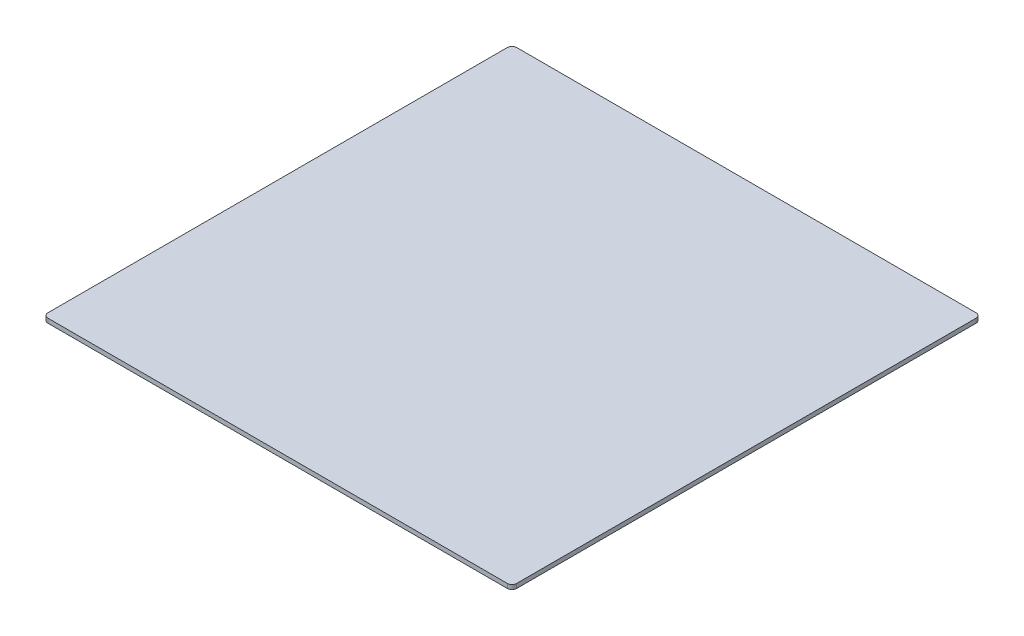
ISO-10303-21;
HEADER;
FILE_DESCRIPTION(('STEP AP214'),'2;1');
FILE_NAME('part.step','',(''),(''),'','','');
FILE_SCHEMA(('AUTOMOTIVE_DESIGN { 1 0 10303 214 1 1 1 1 }'));
ENDSEC;
DATA;
#1=APPLICATION_CONTEXT('core data for automotive mechanical design processes');
#2=APPLICATION_PROTOCOL_DEFINITION('international standard','automotive_design',2000,#1);
#3=PRODUCT_CONTEXT('',#1,'mechanical');
#4=PRODUCT('Part','Part','',(#3));
#5=PRODUCT_RELATED_PRODUCT_CATEGORY('part','',(#4));
#6=PRODUCT_DEFINITION_FORMATION('','',#4);
#7=PRODUCT_DEFINITION_CONTEXT('part definition',#1,'design');
#8=PRODUCT_DEFINITION('design','',#6,#7);
#9=PRODUCT_DEFINITION_SHAPE('','',#8);
#10=(LENGTH_UNIT() NAMED_UNIT(*) SI_UNIT(.MILLI.,.METRE.));
#11=(NAMED_UNIT(*) PLANE_ANGLE_UNIT() SI_UNIT($,.RADIAN.));
#12=(NAMED_UNIT(*) SI_UNIT($,.STERADIAN.) SOLID_ANGLE_UNIT());
#13=UNCERTAINTY_MEASURE_WITH_UNIT(LENGTH_MEASURE(1.E-05),#10,'distance_accuracy_value','');
#14=(GEOMETRIC_REPRESENTATION_CONTEXT(3) GLOBAL_UNCERTAINTY_ASSIGNED_CONTEXT((#13)) GLOBAL_UNIT_ASSIGNED_CONTEXT((#10,
#11,#12)) REPRESENTATION_CONTEXT('',''));
#15=CARTESIAN_POINT('',(0.,0.,0.));
#16=DIRECTION('',(0.,0.,1.));
#17=DIRECTION('',(1.,0.,0.));
#18=AXIS2_PLACEMENT_3D('',#15,#16,#17);
#19=CARTESIAN_POINT('',(50.,0.46865,-50.));
#20=DIRECTION('',(-1.,0.,0.));
#21=DIRECTION('',(0.,0.,1.));
#22=AXIS2_PLACEMENT_3D('',#19,#20,#21);
#23=PLANE('',#22);
#24=DIRECTION('',(0.,0.,-1.));
#25=VECTOR('',#24,1.);
#26=CARTESIAN_POINT('',(50.,0.46865,-50.));
#27=LINE('',#26,#25);
#28=CARTESIAN_POINT('',(50.,0.46865,49.));
#29=VERTEX_POINT('',#28);
#30=CARTESIAN_POINT('',(50.,0.46865,-49.));
#31=VERTEX_POINT('',#30);
#32=EDGE_CURVE('E126',#29,#31,#27,.T.);
#33=ORIENTED_EDGE('',*,*,#32,.F.);
#34=DIRECTION('',(0.,-1.,0.));
#35=VECTOR('',#34,1.);
#36=CARTESIAN_POINT('',(50.,0.46865,49.));
#37=LINE('',#36,#35);
#38=CARTESIAN_POINT('',(50.,-0.46865,49.));
#39=VERTEX_POINT('',#38);
#40=EDGE_CURVE('E110',#29,#39,#37,.T.);
#41=ORIENTED_EDGE('',*,*,#40,.T.);
#42=DIRECTION('',(0.,0.,-1.));
#43=VECTOR('',#42,1.);
#44=CARTESIAN_POINT('',(50.,-0.46865,-50.));
#45=LINE('',#44,#43);
#46=CARTESIAN_POINT('',(50.,-0.46865,-49.));
#47=VERTEX_POINT('',#46);
#48=EDGE_CURVE('E123',#39,#47,#45,.T.);
#49=ORIENTED_EDGE('',*,*,#48,.T.);
#50=DIRECTION('',(0.,-1.,0.));
#51=VECTOR('',#50,1.);
#52=CARTESIAN_POINT('',(50.,0.46865,-49.));
#53=LINE('',#52,#51);
#54=EDGE_CURVE('E129',#47,#31,#53,.F.);
#55=ORIENTED_EDGE('',*,*,#54,.T.);
#56=EDGE_LOOP('',(#33,#41,#49,#55));
#57=FACE_BOUND('',#56,.T.);
#58=ADVANCED_FACE('F39',(#57),#23,.F.);
#59=CARTESIAN_POINT('',(-50.,0.46865,-50.));
#60=DIRECTION('',(0.,0.,1.));
#61=DIRECTION('',(1.,0.,0.));
#62=AXIS2_PLACEMENT_3D('',#59,#60,#61);
#63=PLANE('',#62);
#64=DIRECTION('',(-1.,0.,0.));
#65=VECTOR('',#64,1.);
#66=CARTESIAN_POINT('',(-50.,-0.46865,-50.));
#67=LINE('',#66,#65);
#68=CARTESIAN_POINT('',(49.,-0.46865,-50.));
#69=VERTEX_POINT('',#68);
#70=CARTESIAN_POINT('',(-49.,-0.46865,-50.));
#71=VERTEX_POINT('',#70);
#72=EDGE_CURVE('E134',#69,#71,#67,.T.);
#73=ORIENTED_EDGE('',*,*,#72,.T.);
#74=DIRECTION('',(0.,-1.,0.));
#75=VECTOR('',#74,1.);
#76=CARTESIAN_POINT('',(-49.,0.46865,-50.));
#77=LINE('',#76,#75);
#78=CARTESIAN_POINT('',(-49.,0.46865,-50.));
#79=VERTEX_POINT('',#78);
#80=EDGE_CURVE('E11',#71,#79,#77,.F.);
#81=ORIENTED_EDGE('',*,*,#80,.T.);
#82=DIRECTION('',(-1.,0.,0.));
#83=VECTOR('',#82,1.);
#84=CARTESIAN_POINT('',(-50.,0.46865,-50.));
#85=LINE('',#84,#83);
#86=CARTESIAN_POINT('',(49.,0.46865,-50.));
#87=VERTEX_POINT('',#86);
#88=EDGE_CURVE('E186',#87,#79,#85,.T.);
#89=ORIENTED_EDGE('',*,*,#88,.F.);
#90=DIRECTION('',(0.,-1.,0.));
#91=VECTOR('',#90,1.);
#92=CARTESIAN_POINT('',(49.,0.46865,-50.));
#93=LINE('',#92,#91);
#94=EDGE_CURVE('E48',#87,#69,#93,.T.);
#95=ORIENTED_EDGE('',*,*,#94,.T.);
#96=EDGE_LOOP('',(#73,#81,#89,#95));
#97=FACE_BOUND('',#96,.T.);
#98=ADVANCED_FACE('F184',(#97),#63,.F.);
#99=CARTESIAN_POINT('',(-50.,0.46865,-50.));
#100=DIRECTION('',(1.,0.,0.));
#101=DIRECTION('',(0.,0.,-1.));
#102=AXIS2_PLACEMENT_3D('',#99,#100,#101);
#103=PLANE('',#102);
#104=DIRECTION('',(0.,0.,1.));
#105=VECTOR('',#104,1.);
#106=CARTESIAN_POINT('',(-50.,-0.46865,-50.));
#107=LINE('',#106,#105);
#108=CARTESIAN_POINT('',(-50.,-0.46865,-49.));
#109=VERTEX_POINT('',#108);
#110=CARTESIAN_POINT('',(-50.,-0.46865,49.));
#111=VERTEX_POINT('',#110);
#112=EDGE_CURVE('E138',#109,#111,#107,.T.);
#113=ORIENTED_EDGE('',*,*,#112,.T.);
#114=DIRECTION('',(0.,-1.,0.));
#115=VECTOR('',#114,1.);
#116=CARTESIAN_POINT('',(-50.,0.46865,49.));
#117=LINE('',#116,#115);
#118=CARTESIAN_POINT('',(-50.,0.46865,49.));
#119=VERTEX_POINT('',#118);
#120=EDGE_CURVE('E55',#111,#119,#117,.F.);
#121=ORIENTED_EDGE('',*,*,#120,.T.);
#122=DIRECTION('',(0.,0.,1.));
#123=VECTOR('',#122,1.);
#124=CARTESIAN_POINT('',(-50.,0.46865,-50.));
#125=LINE('',#124,#123);
#126=CARTESIAN_POINT('',(-50.,0.46865,-49.));
#127=VERTEX_POINT('',#126);
#128=EDGE_CURVE('E194',#127,#119,#125,.T.);
#129=ORIENTED_EDGE('',*,*,#128,.F.);
#130=DIRECTION('',(0.,-1.,0.));
#131=VECTOR('',#130,1.);
#132=CARTESIAN_POINT('',(-50.,0.46865,-49.));
#133=LINE('',#132,#131);
#134=EDGE_CURVE('E174',#127,#109,#133,.T.);
#135=ORIENTED_EDGE('',*,*,#134,.T.);
#136=EDGE_LOOP('',(#113,#121,#129,#135));
#137=FACE_BOUND('',#136,.T.);
#138=ADVANCED_FACE('F193',(#137),#103,.F.);
#139=CARTESIAN_POINT('',(-50.,0.46865,50.));
#140=DIRECTION('',(0.,0.,-1.));
#141=DIRECTION('',(-1.,0.,0.));
#142=AXIS2_PLACEMENT_3D('',#139,#140,#141);
#143=PLANE('',#142);
#144=DIRECTION('',(1.,0.,0.));
#145=VECTOR('',#144,1.);
#146=CARTESIAN_POINT('',(-50.,-0.46865,50.));
#147=LINE('',#146,#145);
#148=CARTESIAN_POINT('',(-49.,-0.46865,50.));
#149=VERTEX_POINT('',#148);
#150=CARTESIAN_POINT('',(49.,-0.46865,50.));
#151=VERTEX_POINT('',#150);
#152=EDGE_CURVE('E146',#149,#151,#147,.T.);
#153=ORIENTED_EDGE('',*,*,#152,.T.);
#154=DIRECTION('',(0.,-1.,0.));
#155=VECTOR('',#154,1.);
#156=CARTESIAN_POINT('',(49.,0.46865,50.));
#157=LINE('',#156,#155);
#158=CARTESIAN_POINT('',(49.,0.46865,50.));
#159=VERTEX_POINT('',#158);
#160=EDGE_CURVE('E111',#151,#159,#157,.F.);
#161=ORIENTED_EDGE('',*,*,#160,.T.);
#162=DIRECTION('',(1.,0.,0.));
#163=VECTOR('',#162,1.);
#164=CARTESIAN_POINT('',(-50.,0.46865,50.));
#165=LINE('',#164,#163);
#166=CARTESIAN_POINT('',(-49.,0.46865,50.));
#167=VERTEX_POINT('',#166);
#168=EDGE_CURVE('E141',#167,#159,#165,.T.);
#169=ORIENTED_EDGE('',*,*,#168,.F.);
#170=DIRECTION('',(0.,-1.,0.));
#171=VECTOR('',#170,1.);
#172=CARTESIAN_POINT('',(-49.,0.46865,50.));
#173=LINE('',#172,#171);
#174=EDGE_CURVE('E117',#167,#149,#173,.T.);
#175=ORIENTED_EDGE('',*,*,#174,.T.);
#176=EDGE_LOOP('',(#153,#161,#169,#175));
#177=FACE_BOUND('',#176,.T.);
#178=ADVANCED_FACE('F226',(#177),#143,.F.);
#179=CARTESIAN_POINT('',(0.,0.46865,0.));
#180=DIRECTION('',(0.,1.,0.));
#181=DIRECTION('',(0.,0.,1.));
#182=AXIS2_PLACEMENT_3D('',#179,#180,#181);
#183=PLANE('',#182);
#184=ORIENTED_EDGE('',*,*,#168,.T.);
#185=CARTESIAN_POINT('',(49.,0.46865,49.));
#186=DIRECTION('',(0.,1.,0.));
#187=DIRECTION('',(0.,0.,1.));
#188=AXIS2_PLACEMENT_3D('',#185,#186,#187);
#189=CIRCLE('',#188,1.);
#190=EDGE_CURVE('E171',#159,#29,#189,.T.);
#191=ORIENTED_EDGE('',*,*,#190,.T.);
#192=ORIENTED_EDGE('',*,*,#32,.T.);
#193=CARTESIAN_POINT('',(49.,0.46865,-49.));
#194=DIRECTION('',(0.,1.,0.));
#195=DIRECTION('',(0.,0.,1.));
#196=AXIS2_PLACEMENT_3D('',#193,#194,#195);
#197=CIRCLE('',#196,1.);
#198=EDGE_CURVE('E163',#31,#87,#197,.T.);
#199=ORIENTED_EDGE('',*,*,#198,.T.);
#200=ORIENTED_EDGE('',*,*,#88,.T.);
#201=CARTESIAN_POINT('',(-49.,0.46865,-49.));
#202=DIRECTION('',(0.,1.,0.));
#203=DIRECTION('',(0.,0.,1.));
#204=AXIS2_PLACEMENT_3D('',#201,#202,#203);
#205=CIRCLE('',#204,1.);
#206=EDGE_CURVE('E62',#79,#127,#205,.T.);
#207=ORIENTED_EDGE('',*,*,#206,.T.);
#208=ORIENTED_EDGE('',*,*,#128,.T.);
#209=CARTESIAN_POINT('',(-49.,0.46865,49.));
#210=DIRECTION('',(0.,1.,0.));
#211=DIRECTION('',(0.,0.,1.));
#212=AXIS2_PLACEMENT_3D('',#209,#210,#211);
#213=CIRCLE('',#212,1.);
#214=EDGE_CURVE('E168',#119,#167,#213,.T.);
#215=ORIENTED_EDGE('',*,*,#214,.T.);
#216=EDGE_LOOP('',(#184,#191,#192,#199,#200,#207,#208,#215));
#217=FACE_BOUND('',#216,.T.);
#218=ADVANCED_FACE('F203',(#217),#183,.T.);
#219=CARTESIAN_POINT('',(0.,-0.46865,0.));
#220=DIRECTION('',(0.,1.,0.));
#221=DIRECTION('',(0.,0.,1.));
#222=AXIS2_PLACEMENT_3D('',#219,#220,#221);
#223=PLANE('',#222);
#224=ORIENTED_EDGE('',*,*,#48,.F.);
#225=CARTESIAN_POINT('',(49.,-0.46865,49.));
#226=DIRECTION('',(0.,1.,0.));
#227=DIRECTION('',(0.,0.,1.));
#228=AXIS2_PLACEMENT_3D('',#225,#226,#227);
#229=CIRCLE('',#228,1.);
#230=EDGE_CURVE('E106',#39,#151,#229,.F.);
#231=ORIENTED_EDGE('',*,*,#230,.T.);
#232=ORIENTED_EDGE('',*,*,#152,.F.);
#233=CARTESIAN_POINT('',(-49.,-0.46865,49.));
#234=DIRECTION('',(0.,1.,0.));
#235=DIRECTION('',(0.,0.,1.));
#236=AXIS2_PLACEMENT_3D('',#233,#234,#235);
#237=CIRCLE('',#236,1.);
#238=EDGE_CURVE('E118',#149,#111,#237,.F.);
#239=ORIENTED_EDGE('',*,*,#238,.T.);
#240=ORIENTED_EDGE('',*,*,#112,.F.);
#241=CARTESIAN_POINT('',(-49.,-0.46865,-49.));
#242=DIRECTION('',(0.,1.,0.));
#243=DIRECTION('',(0.,0.,1.));
#244=AXIS2_PLACEMENT_3D('',#241,#242,#243);
#245=CIRCLE('',#244,1.);
#246=EDGE_CURVE('E153',#109,#71,#245,.F.);
#247=ORIENTED_EDGE('',*,*,#246,.T.);
#248=ORIENTED_EDGE('',*,*,#72,.F.);
#249=CARTESIAN_POINT('',(49.,-0.46865,-49.));
#250=DIRECTION('',(0.,1.,0.));
#251=DIRECTION('',(0.,0.,1.));
#252=AXIS2_PLACEMENT_3D('',#249,#250,#251);
#253=CIRCLE('',#252,1.);
#254=EDGE_CURVE('E128',#69,#47,#253,.F.);
#255=ORIENTED_EDGE('',*,*,#254,.T.);
#256=EDGE_LOOP('',(#224,#231,#232,#239,#240,#247,#248,#255));
#257=FACE_BOUND('',#256,.T.);
#258=ADVANCED_FACE('F131',(#257),#223,.F.);
#259=CARTESIAN_POINT('',(49.,0.46865,49.));
#260=DIRECTION('',(0.,-1.,0.));
#261=DIRECTION('',(0.,0.,-1.));
#262=AXIS2_PLACEMENT_3D('',#259,#260,#261);
#263=CYLINDRICAL_SURFACE('',#262,1.);
#264=ORIENTED_EDGE('',*,*,#190,.F.);
#265=ORIENTED_EDGE('',*,*,#160,.F.);
#266=ORIENTED_EDGE('',*,*,#230,.F.);
#267=ORIENTED_EDGE('',*,*,#40,.F.);
#268=EDGE_LOOP('',(#264,#265,#266,#267));
#269=FACE_BOUND('',#268,.T.);
#270=ADVANCED_FACE('F109',(#269),#263,.T.);
#271=CARTESIAN_POINT('',(-49.,0.46865,49.));
#272=DIRECTION('',(0.,-1.,0.));
#273=DIRECTION('',(0.,0.,-1.));
#274=AXIS2_PLACEMENT_3D('',#271,#272,#273);
#275=CYLINDRICAL_SURFACE('',#274,1.);
#276=ORIENTED_EDGE('',*,*,#214,.F.);
#277=ORIENTED_EDGE('',*,*,#120,.F.);
#278=ORIENTED_EDGE('',*,*,#238,.F.);
#279=ORIENTED_EDGE('',*,*,#174,.F.);
#280=EDGE_LOOP('',(#276,#277,#278,#279));
#281=FACE_BOUND('',#280,.T.);
#282=ADVANCED_FACE('F208',(#281),#275,.T.);
#283=CARTESIAN_POINT('',(-49.,0.46865,-49.));
#284=DIRECTION('',(0.,-1.,0.));
#285=DIRECTION('',(0.,0.,-1.));
#286=AXIS2_PLACEMENT_3D('',#283,#284,#285);
#287=CYLINDRICAL_SURFACE('',#286,1.);
#288=ORIENTED_EDGE('',*,*,#206,.F.);
#289=ORIENTED_EDGE('',*,*,#80,.F.);
#290=ORIENTED_EDGE('',*,*,#246,.F.);
#291=ORIENTED_EDGE('',*,*,#134,.F.);
#292=EDGE_LOOP('',(#288,#289,#290,#291));
#293=FACE_BOUND('',#292,.T.);
#294=ADVANCED_FACE('F192',(#293),#287,.T.);
#295=CARTESIAN_POINT('',(49.,0.46865,-49.));
#296=DIRECTION('',(0.,-1.,0.));
#297=DIRECTION('',(0.,0.,-1.));
#298=AXIS2_PLACEMENT_3D('',#295,#296,#297);
#299=CYLINDRICAL_SURFACE('',#298,1.);
#300=ORIENTED_EDGE('',*,*,#198,.F.);
#301=ORIENTED_EDGE('',*,*,#54,.F.);
#302=ORIENTED_EDGE('',*,*,#254,.F.);
#303=ORIENTED_EDGE('',*,*,#94,.F.);
#304=EDGE_LOOP('',(#300,#301,#302,#303));
#305=FACE_BOUND('',#304,.T.);
#306=ADVANCED_FACE('F41',(#305),#299,.T.);
#307=CLOSED_SHELL('',(#58,#98,#138,#178,#218,#258,#270,#282,#294,#306));
#308=MANIFOLD_SOLID_BREP('B2',#307);
#309=ADVANCED_BREP_SHAPE_REPRESENTATION('',(#18,#308),#14);
#310=SHAPE_DEFINITION_REPRESENTATION(#9,#309);
ENDSEC;
END-ISO-10303-21;
